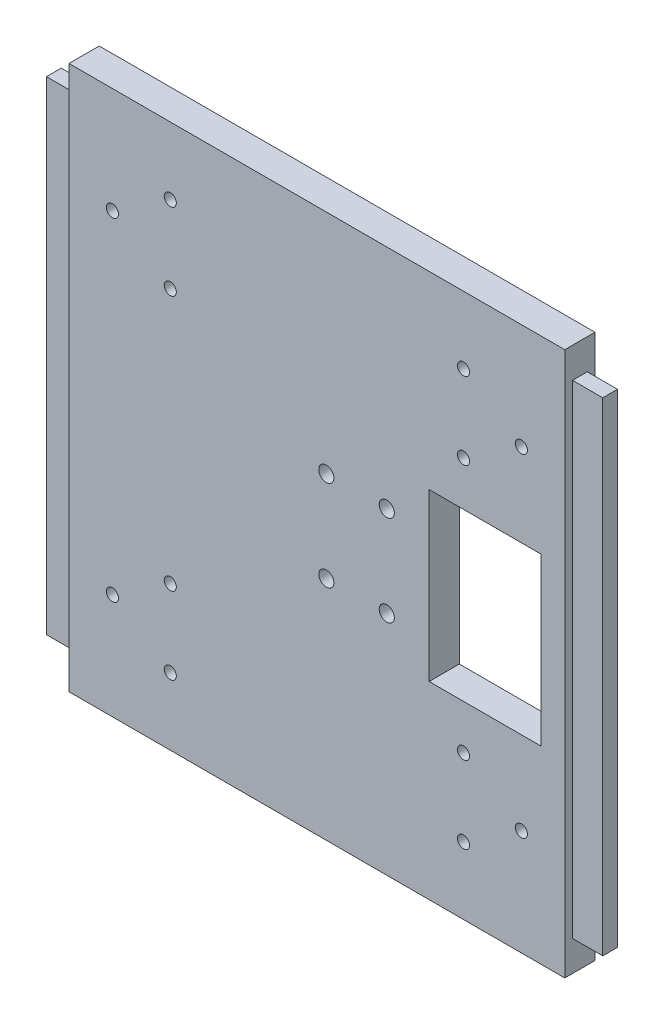
ISO-10303-21;
HEADER;
FILE_DESCRIPTION(('STEP AP214'),'2;1');
FILE_NAME('part.step','',(''),(''),'','','');
FILE_SCHEMA(('AUTOMOTIVE_DESIGN { 1 0 10303 214 1 1 1 1 }'));
ENDSEC;
DATA;
#1=APPLICATION_CONTEXT('core data for automotive mechanical design processes');
#2=APPLICATION_PROTOCOL_DEFINITION('international standard','automotive_design',2000,#1);
#3=PRODUCT_CONTEXT('',#1,'mechanical');
#4=PRODUCT('Part','Part','',(#3));
#5=PRODUCT_RELATED_PRODUCT_CATEGORY('part','',(#4));
#6=PRODUCT_DEFINITION_FORMATION('','',#4);
#7=PRODUCT_DEFINITION_CONTEXT('part definition',#1,'design');
#8=PRODUCT_DEFINITION('design','',#6,#7);
#9=PRODUCT_DEFINITION_SHAPE('','',#8);
#10=(LENGTH_UNIT() NAMED_UNIT(*) SI_UNIT(.MILLI.,.METRE.));
#11=(NAMED_UNIT(*) PLANE_ANGLE_UNIT() SI_UNIT($,.RADIAN.));
#12=(NAMED_UNIT(*) SI_UNIT($,.STERADIAN.) SOLID_ANGLE_UNIT());
#13=UNCERTAINTY_MEASURE_WITH_UNIT(LENGTH_MEASURE(1.E-05),#10,'distance_accuracy_value','');
#14=(GEOMETRIC_REPRESENTATION_CONTEXT(3) GLOBAL_UNCERTAINTY_ASSIGNED_CONTEXT((#13)) GLOBAL_UNIT_ASSIGNED_CONTEXT((#10,
#11,#12)) REPRESENTATION_CONTEXT('',''));
#15=CARTESIAN_POINT('',(0.,0.,0.));
#16=DIRECTION('',(0.,0.,1.));
#17=DIRECTION('',(1.,0.,0.));
#18=AXIS2_PLACEMENT_3D('',#15,#16,#17);
#19=CARTESIAN_POINT('',(0.,0.,10.));
#20=DIRECTION('',(1.,0.,0.));
#21=DIRECTION('',(0.,0.,-1.));
#22=AXIS2_PLACEMENT_3D('',#19,#20,#21);
#23=PLANE('',#22);
#24=DIRECTION('',(0.,-1.,0.));
#25=VECTOR('',#24,1.);
#26=CARTESIAN_POINT('',(0.,0.,0.));
#27=LINE('',#26,#25);
#28=CARTESIAN_POINT('',(0.,180.,0.));
#29=VERTEX_POINT('',#28);
#30=CARTESIAN_POINT('',(0.,0.,0.));
#31=VERTEX_POINT('',#30);
#32=EDGE_CURVE('E189',#29,#31,#27,.T.);
#33=ORIENTED_EDGE('',*,*,#32,.T.);
#34=DIRECTION('',(0.,0.,-1.));
#35=VECTOR('',#34,1.);
#36=CARTESIAN_POINT('',(0.,0.,10.));
#37=LINE('',#36,#35);
#38=CARTESIAN_POINT('',(0.,0.,10.));
#39=VERTEX_POINT('',#38);
#40=EDGE_CURVE('E162',#39,#31,#37,.T.);
#41=ORIENTED_EDGE('',*,*,#40,.F.);
#42=DIRECTION('',(0.,-1.,0.));
#43=VECTOR('',#42,1.);
#44=CARTESIAN_POINT('',(0.,0.,10.));
#45=LINE('',#44,#43);
#46=CARTESIAN_POINT('',(0.,180.,10.));
#47=VERTEX_POINT('',#46);
#48=EDGE_CURVE('E184',#47,#39,#45,.T.);
#49=ORIENTED_EDGE('',*,*,#48,.F.);
#50=DIRECTION('',(0.,0.,-1.));
#51=VECTOR('',#50,1.);
#52=CARTESIAN_POINT('',(0.,180.,10.));
#53=LINE('',#52,#51);
#54=EDGE_CURVE('E178',#47,#29,#53,.T.);
#55=ORIENTED_EDGE('',*,*,#54,.T.);
#56=EDGE_LOOP('',(#33,#41,#49,#55));
#57=FACE_BOUND('',#56,.T.);
#58=DIRECTION('',(0.,-1.,0.));
#59=VECTOR('',#58,1.);
#60=CARTESIAN_POINT('',(0.,169.94,2.55999999999999));
#61=LINE('',#60,#59);
#62=CARTESIAN_POINT('',(0.,169.94,2.55999999999999));
#63=VERTEX_POINT('',#62);
#64=CARTESIAN_POINT('',(0.,10.06,2.56000000000001));
#65=VERTEX_POINT('',#64);
#66=EDGE_CURVE('E222',#63,#65,#61,.T.);
#67=ORIENTED_EDGE('',*,*,#66,.F.);
#68=DIRECTION('',(0.,0.,-1.));
#69=VECTOR('',#68,1.);
#70=CARTESIAN_POINT('',(0.,169.94,2.55999999999999));
#71=LINE('',#70,#69);
#72=CARTESIAN_POINT('',(0.,169.94,7.43999999999999));
#73=VERTEX_POINT('',#72);
#74=EDGE_CURVE('E212',#73,#63,#71,.T.);
#75=ORIENTED_EDGE('',*,*,#74,.F.);
#76=DIRECTION('',(0.,1.,0.));
#77=VECTOR('',#76,1.);
#78=CARTESIAN_POINT('',(0.,169.94,7.43999999999999));
#79=LINE('',#78,#77);
#80=CARTESIAN_POINT('',(0.,10.06,7.44000000000001));
#81=VERTEX_POINT('',#80);
#82=EDGE_CURVE('E216',#81,#73,#79,.T.);
#83=ORIENTED_EDGE('',*,*,#82,.F.);
#84=DIRECTION('',(0.,0.,1.));
#85=VECTOR('',#84,1.);
#86=CARTESIAN_POINT('',(0.,10.06,2.56000000000001));
#87=LINE('',#86,#85);
#88=EDGE_CURVE('E219',#65,#81,#87,.T.);
#89=ORIENTED_EDGE('',*,*,#88,.F.);
#90=EDGE_LOOP('',(#67,#75,#83,#89));
#91=FACE_BOUND('',#90,.T.);
#92=ADVANCED_FACE('F37',(#57,#91),#23,.F.);
#93=CARTESIAN_POINT('',(0.,0.,10.));
#94=DIRECTION('',(0.,1.,0.));
#95=DIRECTION('',(0.,0.,1.));
#96=AXIS2_PLACEMENT_3D('',#93,#94,#95);
#97=PLANE('',#96);
#98=DIRECTION('',(1.,0.,0.));
#99=VECTOR('',#98,1.);
#100=CARTESIAN_POINT('',(0.,0.,0.));
#101=LINE('',#100,#99);
#102=CARTESIAN_POINT('',(164.,0.,0.));
#103=VERTEX_POINT('',#102);
#104=EDGE_CURVE('E187',#31,#103,#101,.T.);
#105=ORIENTED_EDGE('',*,*,#104,.T.);
#106=DIRECTION('',(0.,0.,-1.));
#107=VECTOR('',#106,1.);
#108=CARTESIAN_POINT('',(164.,0.,10.));
#109=LINE('',#108,#107);
#110=CARTESIAN_POINT('',(164.,0.,10.));
#111=VERTEX_POINT('',#110);
#112=EDGE_CURVE('E172',#111,#103,#109,.T.);
#113=ORIENTED_EDGE('',*,*,#112,.F.);
#114=DIRECTION('',(1.,0.,0.));
#115=VECTOR('',#114,1.);
#116=CARTESIAN_POINT('',(0.,0.,10.));
#117=LINE('',#116,#115);
#118=EDGE_CURVE('E196',#39,#111,#117,.T.);
#119=ORIENTED_EDGE('',*,*,#118,.F.);
#120=ORIENTED_EDGE('',*,*,#40,.T.);
#121=EDGE_LOOP('',(#105,#113,#119,#120));
#122=FACE_BOUND('',#121,.T.);
#123=ADVANCED_FACE('F425',(#122),#97,.F.);
#124=CARTESIAN_POINT('',(164.,0.,10.));
#125=DIRECTION('',(-1.,0.,0.));
#126=DIRECTION('',(0.,0.,1.));
#127=AXIS2_PLACEMENT_3D('',#124,#125,#126);
#128=PLANE('',#127);
#129=DIRECTION('',(0.,0.,-1.));
#130=VECTOR('',#129,1.);
#131=CARTESIAN_POINT('',(164.,169.94,2.55999999999999));
#132=LINE('',#131,#130);
#133=CARTESIAN_POINT('',(164.,169.94,7.43999999999999));
#134=VERTEX_POINT('',#133);
#135=CARTESIAN_POINT('',(164.,169.94,2.55999999999999));
#136=VERTEX_POINT('',#135);
#137=EDGE_CURVE('E249',#134,#136,#132,.T.);
#138=ORIENTED_EDGE('',*,*,#137,.T.);
#139=DIRECTION('',(0.,-1.,0.));
#140=VECTOR('',#139,1.);
#141=CARTESIAN_POINT('',(164.,169.94,2.55999999999999));
#142=LINE('',#141,#140);
#143=CARTESIAN_POINT('',(164.,10.06,2.56000000000001));
#144=VERTEX_POINT('',#143);
#145=EDGE_CURVE('E252',#136,#144,#142,.T.);
#146=ORIENTED_EDGE('',*,*,#145,.T.);
#147=DIRECTION('',(0.,0.,1.));
#148=VECTOR('',#147,1.);
#149=CARTESIAN_POINT('',(164.,10.06,2.56000000000001));
#150=LINE('',#149,#148);
#151=CARTESIAN_POINT('',(164.,10.06,7.44000000000001));
#152=VERTEX_POINT('',#151);
#153=EDGE_CURVE('E242',#144,#152,#150,.T.);
#154=ORIENTED_EDGE('',*,*,#153,.T.);
#155=DIRECTION('',(0.,1.,0.));
#156=VECTOR('',#155,1.);
#157=CARTESIAN_POINT('',(164.,169.94,7.43999999999999));
#158=LINE('',#157,#156);
#159=EDGE_CURVE('E246',#152,#134,#158,.T.);
#160=ORIENTED_EDGE('',*,*,#159,.T.);
#161=EDGE_LOOP('',(#138,#146,#154,#160));
#162=FACE_BOUND('',#161,.T.);
#163=DIRECTION('',(0.,1.,0.));
#164=VECTOR('',#163,1.);
#165=CARTESIAN_POINT('',(164.,0.,0.));
#166=LINE('',#165,#164);
#167=CARTESIAN_POINT('',(164.,180.,0.));
#168=VERTEX_POINT('',#167);
#169=EDGE_CURVE('E185',#103,#168,#166,.T.);
#170=ORIENTED_EDGE('',*,*,#169,.T.);
#171=DIRECTION('',(0.,0.,-1.));
#172=VECTOR('',#171,1.);
#173=CARTESIAN_POINT('',(164.,180.,10.));
#174=LINE('',#173,#172);
#175=CARTESIAN_POINT('',(164.,180.,10.));
#176=VERTEX_POINT('',#175);
#177=EDGE_CURVE('E175',#176,#168,#174,.T.);
#178=ORIENTED_EDGE('',*,*,#177,.F.);
#179=DIRECTION('',(0.,1.,0.));
#180=VECTOR('',#179,1.);
#181=CARTESIAN_POINT('',(164.,0.,10.));
#182=LINE('',#181,#180);
#183=EDGE_CURVE('E194',#111,#176,#182,.T.);
#184=ORIENTED_EDGE('',*,*,#183,.F.);
#185=ORIENTED_EDGE('',*,*,#112,.T.);
#186=EDGE_LOOP('',(#170,#178,#184,#185));
#187=FACE_BOUND('',#186,.T.);
#188=ADVANCED_FACE('F430',(#162,#187),#128,.F.);
#189=CARTESIAN_POINT('',(0.,180.,10.));
#190=DIRECTION('',(0.,-1.,0.));
#191=DIRECTION('',(0.,0.,-1.));
#192=AXIS2_PLACEMENT_3D('',#189,#190,#191);
#193=PLANE('',#192);
#194=DIRECTION('',(-1.,0.,0.));
#195=VECTOR('',#194,1.);
#196=CARTESIAN_POINT('',(0.,180.,0.));
#197=LINE('',#196,#195);
#198=EDGE_CURVE('E182',#168,#29,#197,.T.);
#199=ORIENTED_EDGE('',*,*,#198,.T.);
#200=ORIENTED_EDGE('',*,*,#54,.F.);
#201=DIRECTION('',(-1.,0.,0.));
#202=VECTOR('',#201,1.);
#203=CARTESIAN_POINT('',(0.,180.,10.));
#204=LINE('',#203,#202);
#205=EDGE_CURVE('E181',#176,#47,#204,.T.);
#206=ORIENTED_EDGE('',*,*,#205,.F.);
#207=ORIENTED_EDGE('',*,*,#177,.T.);
#208=EDGE_LOOP('',(#199,#200,#206,#207));
#209=FACE_BOUND('',#208,.T.);
#210=ADVANCED_FACE('F385',(#209),#193,.F.);
#211=CARTESIAN_POINT('',(0.,0.,10.));
#212=DIRECTION('',(0.,0.,-1.));
#213=DIRECTION('',(-1.,0.,0.));
#214=AXIS2_PLACEMENT_3D('',#211,#212,#213);
#215=PLANE('',#214);
#216=CARTESIAN_POINT('',(85.1178631754565,75.,10.));
#217=DIRECTION('',(0.,0.,1.));
#218=DIRECTION('',(1.,0.,0.));
#219=AXIS2_PLACEMENT_3D('',#216,#217,#218);
#220=CIRCLE('',#219,2.5);
#221=CARTESIAN_POINT('',(87.6178631754566,75.,10.));
#222=VERTEX_POINT('',#221);
#223=EDGE_CURVE('E153',#222,#222,#220,.T.);
#224=ORIENTED_EDGE('',*,*,#223,.F.);
#225=EDGE_LOOP('',(#224));
#226=FACE_BOUND('',#225,.T.);
#227=DIRECTION('',(1.,0.,0.));
#228=VECTOR('',#227,1.);
#229=CARTESIAN_POINT('',(119.117863175457,62.5,10.));
#230=LINE('',#229,#228);
#231=CARTESIAN_POINT('',(119.117863175457,62.5,10.));
#232=VERTEX_POINT('',#231);
#233=CARTESIAN_POINT('',(156.117863175457,62.5,10.));
#234=VERTEX_POINT('',#233);
#235=EDGE_CURVE('E352',#232,#234,#230,.T.);
#236=ORIENTED_EDGE('',*,*,#235,.F.);
#237=DIRECTION('',(0.,-1.,0.));
#238=VECTOR('',#237,1.);
#239=CARTESIAN_POINT('',(119.117863175457,117.5,10.));
#240=LINE('',#239,#238);
#241=CARTESIAN_POINT('',(119.117863175457,117.5,10.));
#242=VERTEX_POINT('',#241);
#243=EDGE_CURVE('E56',#242,#232,#240,.T.);
#244=ORIENTED_EDGE('',*,*,#243,.F.);
#245=DIRECTION('',(-1.,0.,0.));
#246=VECTOR('',#245,1.);
#247=CARTESIAN_POINT('',(119.117863175457,117.5,10.));
#248=LINE('',#247,#246);
#249=CARTESIAN_POINT('',(156.117863175457,117.5,10.));
#250=VERTEX_POINT('',#249);
#251=EDGE_CURVE('E152',#250,#242,#248,.T.);
#252=ORIENTED_EDGE('',*,*,#251,.F.);
#253=DIRECTION('',(0.,1.,0.));
#254=VECTOR('',#253,1.);
#255=CARTESIAN_POINT('',(156.117863175457,117.5,10.));
#256=LINE('',#255,#254);
#257=EDGE_CURVE('E349',#234,#250,#256,.T.);
#258=ORIENTED_EDGE('',*,*,#257,.F.);
#259=EDGE_LOOP('',(#236,#244,#252,#258));
#260=FACE_BOUND('',#259,.T.);
#261=CARTESIAN_POINT('',(105.117863175457,105.,10.));
#262=DIRECTION('',(0.,0.,1.));
#263=DIRECTION('',(1.,0.,0.));
#264=AXIS2_PLACEMENT_3D('',#261,#262,#263);
#265=CIRCLE('',#264,2.50000000000001);
#266=CARTESIAN_POINT('',(107.617863175457,105.,10.));
#267=VERTEX_POINT('',#266);
#268=EDGE_CURVE('E367',#267,#267,#265,.T.);
#269=ORIENTED_EDGE('',*,*,#268,.F.);
#270=EDGE_LOOP('',(#269));
#271=FACE_BOUND('',#270,.T.);
#272=CARTESIAN_POINT('',(105.117863175457,75.,10.));
#273=DIRECTION('',(0.,0.,1.));
#274=DIRECTION('',(1.,0.,0.));
#275=AXIS2_PLACEMENT_3D('',#272,#273,#274);
#276=CIRCLE('',#275,2.50000000000001);
#277=CARTESIAN_POINT('',(107.617863175457,75.,10.));
#278=VERTEX_POINT('',#277);
#279=EDGE_CURVE('E361',#278,#278,#276,.T.);
#280=ORIENTED_EDGE('',*,*,#279,.F.);
#281=EDGE_LOOP('',(#280));
#282=FACE_BOUND('',#281,.T.);
#283=CARTESIAN_POINT('',(85.1178631754565,105.,10.));
#284=DIRECTION('',(0.,0.,1.));
#285=DIRECTION('',(1.,0.,0.));
#286=AXIS2_PLACEMENT_3D('',#283,#284,#285);
#287=CIRCLE('',#286,2.5);
#288=CARTESIAN_POINT('',(87.6178631754566,105.,10.));
#289=VERTEX_POINT('',#288);
#290=EDGE_CURVE('E338',#289,#289,#287,.T.);
#291=ORIENTED_EDGE('',*,*,#290,.F.);
#292=EDGE_LOOP('',(#291));
#293=FACE_BOUND('',#292,.T.);
#294=CARTESIAN_POINT('',(149.642557300424,35.,10.));
#295=DIRECTION('',(0.,0.,-1.));
#296=DIRECTION('',(1.,0.,0.));
#297=AXIS2_PLACEMENT_3D('',#294,#295,#296);
#298=CIRCLE('',#297,2.);
#299=CARTESIAN_POINT('',(151.642557300424,35.,10.));
#300=VERTEX_POINT('',#299);
#301=EDGE_CURVE('E299',#300,#300,#298,.T.);
#302=ORIENTED_EDGE('',*,*,#301,.T.);
#303=EDGE_LOOP('',(#302));
#304=FACE_BOUND('',#303,.T.);
#305=CARTESIAN_POINT('',(130.5,22.25,10.));
#306=DIRECTION('',(0.,0.,-1.));
#307=DIRECTION('',(1.,0.,0.));
#308=AXIS2_PLACEMENT_3D('',#305,#306,#307);
#309=CIRCLE('',#308,2.);
#310=CARTESIAN_POINT('',(132.5,22.25,10.));
#311=VERTEX_POINT('',#310);
#312=EDGE_CURVE('E306',#311,#311,#309,.T.);
#313=ORIENTED_EDGE('',*,*,#312,.T.);
#314=EDGE_LOOP('',(#313));
#315=FACE_BOUND('',#314,.T.);
#316=CARTESIAN_POINT('',(130.5,47.75,10.));
#317=DIRECTION('',(0.,0.,-1.));
#318=DIRECTION('',(1.,0.,0.));
#319=AXIS2_PLACEMENT_3D('',#316,#317,#318);
#320=CIRCLE('',#319,2.);
#321=CARTESIAN_POINT('',(132.5,47.75,10.));
#322=VERTEX_POINT('',#321);
#323=EDGE_CURVE('E312',#322,#322,#320,.T.);
#324=ORIENTED_EDGE('',*,*,#323,.T.);
#325=EDGE_LOOP('',(#324));
#326=FACE_BOUND('',#325,.T.);
#327=CARTESIAN_POINT('',(33.5,132.25,10.));
#328=DIRECTION('',(0.,0.,-1.));
#329=DIRECTION('',(-1.,0.,0.));
#330=AXIS2_PLACEMENT_3D('',#327,#328,#329);
#331=CIRCLE('',#330,2.);
#332=CARTESIAN_POINT('',(31.5,132.25,10.));
#333=VERTEX_POINT('',#332);
#334=EDGE_CURVE('E276',#333,#333,#331,.T.);
#335=ORIENTED_EDGE('',*,*,#334,.T.);
#336=EDGE_LOOP('',(#335));
#337=FACE_BOUND('',#336,.T.);
#338=CARTESIAN_POINT('',(33.5,157.75,10.));
#339=DIRECTION('',(0.,0.,-1.));
#340=DIRECTION('',(-1.,0.,0.));
#341=AXIS2_PLACEMENT_3D('',#338,#339,#340);
#342=CIRCLE('',#341,2.00000000000001);
#343=CARTESIAN_POINT('',(31.5,157.75,10.));
#344=VERTEX_POINT('',#343);
#345=EDGE_CURVE('E275',#344,#344,#342,.T.);
#346=ORIENTED_EDGE('',*,*,#345,.T.);
#347=EDGE_LOOP('',(#346));
#348=FACE_BOUND('',#347,.T.);
#349=CARTESIAN_POINT('',(14.3574426995764,145.,10.));
#350=DIRECTION('',(0.,0.,-1.));
#351=DIRECTION('',(-1.,0.,0.));
#352=AXIS2_PLACEMENT_3D('',#349,#350,#351);
#353=CIRCLE('',#352,2.);
#354=CARTESIAN_POINT('',(12.3574426995764,145.,10.));
#355=VERTEX_POINT('',#354);
#356=EDGE_CURVE('E282',#355,#355,#353,.T.);
#357=ORIENTED_EDGE('',*,*,#356,.T.);
#358=EDGE_LOOP('',(#357));
#359=FACE_BOUND('',#358,.T.);
#360=CARTESIAN_POINT('',(130.5,132.25,10.));
#361=DIRECTION('',(0.,0.,-1.));
#362=DIRECTION('',(-1.,0.,0.));
#363=AXIS2_PLACEMENT_3D('',#360,#361,#362);
#364=CIRCLE('',#363,2.);
#365=CARTESIAN_POINT('',(128.5,132.25,10.));
#366=VERTEX_POINT('',#365);
#367=EDGE_CURVE('E288',#366,#366,#364,.T.);
#368=ORIENTED_EDGE('',*,*,#367,.T.);
#369=EDGE_LOOP('',(#368));
#370=FACE_BOUND('',#369,.T.);
#371=CARTESIAN_POINT('',(130.5,157.75,10.));
#372=DIRECTION('',(0.,0.,-1.));
#373=DIRECTION('',(-1.,0.,0.));
#374=AXIS2_PLACEMENT_3D('',#371,#372,#373);
#375=CIRCLE('',#374,2.);
#376=CARTESIAN_POINT('',(128.5,157.75,10.));
#377=VERTEX_POINT('',#376);
#378=EDGE_CURVE('E269',#377,#377,#375,.T.);
#379=ORIENTED_EDGE('',*,*,#378,.T.);
#380=EDGE_LOOP('',(#379));
#381=FACE_BOUND('',#380,.T.);
#382=CARTESIAN_POINT('',(33.5,47.75,10.));
#383=DIRECTION('',(0.,0.,-1.));
#384=DIRECTION('',(1.,0.,0.));
#385=AXIS2_PLACEMENT_3D('',#382,#383,#384);
#386=CIRCLE('',#385,2.);
#387=CARTESIAN_POINT('',(35.5,47.75,10.));
#388=VERTEX_POINT('',#387);
#389=EDGE_CURVE('E300',#388,#388,#386,.T.);
#390=ORIENTED_EDGE('',*,*,#389,.T.);
#391=EDGE_LOOP('',(#390));
#392=FACE_BOUND('',#391,.T.);
#393=CARTESIAN_POINT('',(33.5,22.25,10.));
#394=DIRECTION('',(0.,0.,-1.));
#395=DIRECTION('',(1.,0.,0.));
#396=AXIS2_PLACEMENT_3D('',#393,#394,#395);
#397=CIRCLE('',#396,2.00000000000001);
#398=CARTESIAN_POINT('',(35.5,22.25,10.));
#399=VERTEX_POINT('',#398);
#400=EDGE_CURVE('E330',#399,#399,#397,.T.);
#401=ORIENTED_EDGE('',*,*,#400,.T.);
#402=EDGE_LOOP('',(#401));
#403=FACE_BOUND('',#402,.T.);
#404=CARTESIAN_POINT('',(14.3574426995764,35.,10.));
#405=DIRECTION('',(0.,0.,-1.));
#406=DIRECTION('',(1.,0.,0.));
#407=AXIS2_PLACEMENT_3D('',#404,#405,#406);
#408=CIRCLE('',#407,2.);
#409=CARTESIAN_POINT('',(16.3574426995764,35.,10.));
#410=VERTEX_POINT('',#409);
#411=EDGE_CURVE('E323',#410,#410,#408,.T.);
#412=ORIENTED_EDGE('',*,*,#411,.T.);
#413=EDGE_LOOP('',(#412));
#414=FACE_BOUND('',#413,.T.);
#415=CARTESIAN_POINT('',(149.642557300424,145.,10.));
#416=DIRECTION('',(0.,0.,-1.));
#417=DIRECTION('',(-1.,0.,0.));
#418=AXIS2_PLACEMENT_3D('',#415,#416,#417);
#419=CIRCLE('',#418,2.);
#420=CARTESIAN_POINT('',(147.642557300424,145.,10.));
#421=VERTEX_POINT('',#420);
#422=EDGE_CURVE('E255',#421,#421,#419,.T.);
#423=ORIENTED_EDGE('',*,*,#422,.T.);
#424=EDGE_LOOP('',(#423));
#425=FACE_BOUND('',#424,.T.);
#426=ORIENTED_EDGE('',*,*,#48,.T.);
#427=ORIENTED_EDGE('',*,*,#118,.T.);
#428=ORIENTED_EDGE('',*,*,#183,.T.);
#429=ORIENTED_EDGE('',*,*,#205,.T.);
#430=EDGE_LOOP('',(#426,#427,#428,#429));
#431=FACE_BOUND('',#430,.T.);
#432=ADVANCED_FACE('F382',(#226,#260,#271,#282,#293,#304,#315,#326,#337,#348,#359,#370,#381,
#392,#403,#414,#425,#431),#215,.F.);
#433=CARTESIAN_POINT('',(0.,0.,0.));
#434=DIRECTION('',(0.,0.,-1.));
#435=DIRECTION('',(-1.,0.,0.));
#436=AXIS2_PLACEMENT_3D('',#433,#434,#435);
#437=PLANE('',#436);
#438=DIRECTION('',(1.,0.,0.));
#439=VECTOR('',#438,1.);
#440=CARTESIAN_POINT('',(0.,117.5,0.));
#441=LINE('',#440,#439);
#442=CARTESIAN_POINT('',(119.117863175457,117.5,0.));
#443=VERTEX_POINT('',#442);
#444=CARTESIAN_POINT('',(156.117863175457,117.5,0.));
#445=VERTEX_POINT('',#444);
#446=EDGE_CURVE('E11',#443,#445,#441,.T.);
#447=ORIENTED_EDGE('',*,*,#446,.F.);
#448=DIRECTION('',(0.,1.,0.));
#449=VECTOR('',#448,1.);
#450=CARTESIAN_POINT('',(119.117863175457,0.,0.));
#451=LINE('',#450,#449);
#452=CARTESIAN_POINT('',(119.117863175457,62.5,0.));
#453=VERTEX_POINT('',#452);
#454=EDGE_CURVE('E157',#453,#443,#451,.T.);
#455=ORIENTED_EDGE('',*,*,#454,.F.);
#456=DIRECTION('',(-1.,0.,0.));
#457=VECTOR('',#456,1.);
#458=CARTESIAN_POINT('',(0.,62.5,0.));
#459=LINE('',#458,#457);
#460=CARTESIAN_POINT('',(156.117863175457,62.5,0.));
#461=VERTEX_POINT('',#460);
#462=EDGE_CURVE('E161',#461,#453,#459,.T.);
#463=ORIENTED_EDGE('',*,*,#462,.F.);
#464=DIRECTION('',(0.,-1.,0.));
#465=VECTOR('',#464,1.);
#466=CARTESIAN_POINT('',(156.117863175457,0.,0.));
#467=LINE('',#466,#465);
#468=EDGE_CURVE('E44',#445,#461,#467,.T.);
#469=ORIENTED_EDGE('',*,*,#468,.F.);
#470=EDGE_LOOP('',(#447,#455,#463,#469));
#471=FACE_BOUND('',#470,.T.);
#472=CARTESIAN_POINT('',(149.642557300424,35.,0.));
#473=DIRECTION('',(0.,0.,-1.));
#474=DIRECTION('',(1.,0.,0.));
#475=AXIS2_PLACEMENT_3D('',#472,#473,#474);
#476=CIRCLE('',#475,2.);
#477=CARTESIAN_POINT('',(151.642557300424,35.,0.));
#478=VERTEX_POINT('',#477);
#479=EDGE_CURVE('E296',#478,#478,#476,.T.);
#480=ORIENTED_EDGE('',*,*,#479,.F.);
#481=EDGE_LOOP('',(#480));
#482=FACE_BOUND('',#481,.T.);
#483=CARTESIAN_POINT('',(130.5,22.25,0.));
#484=DIRECTION('',(0.,0.,-1.));
#485=DIRECTION('',(1.,0.,0.));
#486=AXIS2_PLACEMENT_3D('',#483,#484,#485);
#487=CIRCLE('',#486,2.);
#488=CARTESIAN_POINT('',(132.5,22.25,0.));
#489=VERTEX_POINT('',#488);
#490=EDGE_CURVE('E303',#489,#489,#487,.T.);
#491=ORIENTED_EDGE('',*,*,#490,.F.);
#492=EDGE_LOOP('',(#491));
#493=FACE_BOUND('',#492,.T.);
#494=CARTESIAN_POINT('',(130.5,47.75,0.));
#495=DIRECTION('',(0.,0.,-1.));
#496=DIRECTION('',(1.,0.,0.));
#497=AXIS2_PLACEMENT_3D('',#494,#495,#496);
#498=CIRCLE('',#497,2.);
#499=CARTESIAN_POINT('',(132.5,47.75,0.));
#500=VERTEX_POINT('',#499);
#501=EDGE_CURVE('E309',#500,#500,#498,.T.);
#502=ORIENTED_EDGE('',*,*,#501,.F.);
#503=EDGE_LOOP('',(#502));
#504=FACE_BOUND('',#503,.T.);
#505=CARTESIAN_POINT('',(33.5,132.25,0.));
#506=DIRECTION('',(0.,0.,-1.));
#507=DIRECTION('',(-1.,0.,0.));
#508=AXIS2_PLACEMENT_3D('',#505,#506,#507);
#509=CIRCLE('',#508,2.);
#510=CARTESIAN_POINT('',(31.5,132.25,0.));
#511=VERTEX_POINT('',#510);
#512=EDGE_CURVE('E315',#511,#511,#509,.T.);
#513=ORIENTED_EDGE('',*,*,#512,.F.);
#514=EDGE_LOOP('',(#513));
#515=FACE_BOUND('',#514,.T.);
#516=CARTESIAN_POINT('',(33.5,157.75,0.));
#517=DIRECTION('',(0.,0.,-1.));
#518=DIRECTION('',(-1.,0.,0.));
#519=AXIS2_PLACEMENT_3D('',#516,#517,#518);
#520=CIRCLE('',#519,2.00000000000001);
#521=CARTESIAN_POINT('',(31.5,157.75,0.));
#522=VERTEX_POINT('',#521);
#523=EDGE_CURVE('E272',#522,#522,#520,.T.);
#524=ORIENTED_EDGE('',*,*,#523,.F.);
#525=EDGE_LOOP('',(#524));
#526=FACE_BOUND('',#525,.T.);
#527=CARTESIAN_POINT('',(14.3574426995764,145.,0.));
#528=DIRECTION('',(0.,0.,-1.));
#529=DIRECTION('',(-1.,0.,0.));
#530=AXIS2_PLACEMENT_3D('',#527,#528,#529);
#531=CIRCLE('',#530,2.);
#532=CARTESIAN_POINT('',(12.3574426995764,145.,0.));
#533=VERTEX_POINT('',#532);
#534=EDGE_CURVE('E279',#533,#533,#531,.T.);
#535=ORIENTED_EDGE('',*,*,#534,.F.);
#536=EDGE_LOOP('',(#535));
#537=FACE_BOUND('',#536,.T.);
#538=CARTESIAN_POINT('',(130.5,132.25,0.));
#539=DIRECTION('',(0.,0.,-1.));
#540=DIRECTION('',(-1.,0.,0.));
#541=AXIS2_PLACEMENT_3D('',#538,#539,#540);
#542=CIRCLE('',#541,2.);
#543=CARTESIAN_POINT('',(128.5,132.25,0.));
#544=VERTEX_POINT('',#543);
#545=EDGE_CURVE('E285',#544,#544,#542,.T.);
#546=ORIENTED_EDGE('',*,*,#545,.F.);
#547=EDGE_LOOP('',(#546));
#548=FACE_BOUND('',#547,.T.);
#549=CARTESIAN_POINT('',(130.5,157.75,0.));
#550=DIRECTION('',(0.,0.,-1.));
#551=DIRECTION('',(-1.,0.,0.));
#552=AXIS2_PLACEMENT_3D('',#549,#550,#551);
#553=CIRCLE('',#552,2.);
#554=CARTESIAN_POINT('',(128.5,157.75,0.));
#555=VERTEX_POINT('',#554);
#556=EDGE_CURVE('E291',#555,#555,#553,.T.);
#557=ORIENTED_EDGE('',*,*,#556,.F.);
#558=EDGE_LOOP('',(#557));
#559=FACE_BOUND('',#558,.T.);
#560=CARTESIAN_POINT('',(33.5,47.75,0.));
#561=DIRECTION('',(0.,0.,-1.));
#562=DIRECTION('',(1.,0.,0.));
#563=AXIS2_PLACEMENT_3D('',#560,#561,#562);
#564=CIRCLE('',#563,2.);
#565=CARTESIAN_POINT('',(35.5,47.75,0.));
#566=VERTEX_POINT('',#565);
#567=EDGE_CURVE('E333',#566,#566,#564,.T.);
#568=ORIENTED_EDGE('',*,*,#567,.F.);
#569=EDGE_LOOP('',(#568));
#570=FACE_BOUND('',#569,.T.);
#571=CARTESIAN_POINT('',(33.5,22.25,0.));
#572=DIRECTION('',(0.,0.,-1.));
#573=DIRECTION('',(1.,0.,0.));
#574=AXIS2_PLACEMENT_3D('',#571,#572,#573);
#575=CIRCLE('',#574,2.00000000000001);
#576=CARTESIAN_POINT('',(35.5,22.25,0.));
#577=VERTEX_POINT('',#576);
#578=EDGE_CURVE('E327',#577,#577,#575,.T.);
#579=ORIENTED_EDGE('',*,*,#578,.F.);
#580=EDGE_LOOP('',(#579));
#581=FACE_BOUND('',#580,.T.);
#582=CARTESIAN_POINT('',(14.3574426995764,35.,0.));
#583=DIRECTION('',(0.,0.,-1.));
#584=DIRECTION('',(1.,0.,0.));
#585=AXIS2_PLACEMENT_3D('',#582,#583,#584);
#586=CIRCLE('',#585,2.);
#587=CARTESIAN_POINT('',(16.3574426995764,35.,0.));
#588=VERTEX_POINT('',#587);
#589=EDGE_CURVE('E320',#588,#588,#586,.T.);
#590=ORIENTED_EDGE('',*,*,#589,.F.);
#591=EDGE_LOOP('',(#590));
#592=FACE_BOUND('',#591,.T.);
#593=CARTESIAN_POINT('',(149.642557300424,145.,0.));
#594=DIRECTION('',(0.,0.,-1.));
#595=DIRECTION('',(-1.,0.,0.));
#596=AXIS2_PLACEMENT_3D('',#593,#594,#595);
#597=CIRCLE('',#596,2.);
#598=CARTESIAN_POINT('',(147.642557300424,145.,0.));
#599=VERTEX_POINT('',#598);
#600=EDGE_CURVE('E266',#599,#599,#597,.T.);
#601=ORIENTED_EDGE('',*,*,#600,.F.);
#602=EDGE_LOOP('',(#601));
#603=FACE_BOUND('',#602,.T.);
#604=ORIENTED_EDGE('',*,*,#32,.F.);
#605=ORIENTED_EDGE('',*,*,#198,.F.);
#606=ORIENTED_EDGE('',*,*,#169,.F.);
#607=ORIENTED_EDGE('',*,*,#104,.F.);
#608=EDGE_LOOP('',(#604,#605,#606,#607));
#609=FACE_BOUND('',#608,.T.);
#610=ADVANCED_FACE('F164',(#471,#482,#493,#504,#515,#526,#537,#548,#559,#570,#581,#592,#603,
#609),#437,.T.);
#611=CARTESIAN_POINT('',(-10.,169.94,2.55999999999999));
#612=DIRECTION('',(0.,0.,1.));
#613=DIRECTION('',(0.,-1.,0.));
#614=AXIS2_PLACEMENT_3D('',#611,#612,#613);
#615=PLANE('',#614);
#616=ORIENTED_EDGE('',*,*,#66,.T.);
#617=DIRECTION('',(1.,0.,0.));
#618=VECTOR('',#617,1.);
#619=CARTESIAN_POINT('',(-10.,10.06,2.56000000000001));
#620=LINE('',#619,#618);
#621=CARTESIAN_POINT('',(-10.,10.06,2.56000000000001));
#622=VERTEX_POINT('',#621);
#623=EDGE_CURVE('E192',#622,#65,#620,.T.);
#624=ORIENTED_EDGE('',*,*,#623,.F.);
#625=DIRECTION('',(0.,-1.,0.));
#626=VECTOR('',#625,1.);
#627=CARTESIAN_POINT('',(-10.,169.94,2.55999999999999));
#628=LINE('',#627,#626);
#629=CARTESIAN_POINT('',(-10.,169.94,2.55999999999999));
#630=VERTEX_POINT('',#629);
#631=EDGE_CURVE('E215',#630,#622,#628,.T.);
#632=ORIENTED_EDGE('',*,*,#631,.F.);
#633=DIRECTION('',(1.,0.,0.));
#634=VECTOR('',#633,1.);
#635=CARTESIAN_POINT('',(-10.,169.94,2.55999999999999));
#636=LINE('',#635,#634);
#637=EDGE_CURVE('E208',#630,#63,#636,.T.);
#638=ORIENTED_EDGE('',*,*,#637,.T.);
#639=EDGE_LOOP('',(#616,#624,#632,#638));
#640=FACE_BOUND('',#639,.T.);
#641=ADVANCED_FACE('F435',(#640),#615,.F.);
#642=CARTESIAN_POINT('',(-10.,10.06,2.56000000000001));
#643=DIRECTION('',(0.,1.,0.));
#644=DIRECTION('',(0.,0.,1.));
#645=AXIS2_PLACEMENT_3D('',#642,#643,#644);
#646=PLANE('',#645);
#647=ORIENTED_EDGE('',*,*,#88,.T.);
#648=DIRECTION('',(1.,0.,0.));
#649=VECTOR('',#648,1.);
#650=CARTESIAN_POINT('',(-10.,10.06,7.44000000000001));
#651=LINE('',#650,#649);
#652=CARTESIAN_POINT('',(-10.,10.06,7.44000000000001));
#653=VERTEX_POINT('',#652);
#654=EDGE_CURVE('E202',#653,#81,#651,.T.);
#655=ORIENTED_EDGE('',*,*,#654,.F.);
#656=DIRECTION('',(0.,0.,1.));
#657=VECTOR('',#656,1.);
#658=CARTESIAN_POINT('',(-10.,10.06,2.56000000000001));
#659=LINE('',#658,#657);
#660=EDGE_CURVE('E229',#622,#653,#659,.T.);
#661=ORIENTED_EDGE('',*,*,#660,.F.);
#662=ORIENTED_EDGE('',*,*,#623,.T.);
#663=EDGE_LOOP('',(#647,#655,#661,#662));
#664=FACE_BOUND('',#663,.T.);
#665=ADVANCED_FACE('F440',(#664),#646,.F.);
#666=CARTESIAN_POINT('',(-10.,169.94,7.43999999999999));
#667=DIRECTION('',(0.,0.,-1.));
#668=DIRECTION('',(0.,1.,0.));
#669=AXIS2_PLACEMENT_3D('',#666,#667,#668);
#670=PLANE('',#669);
#671=ORIENTED_EDGE('',*,*,#82,.T.);
#672=DIRECTION('',(1.,0.,0.));
#673=VECTOR('',#672,1.);
#674=CARTESIAN_POINT('',(-10.,169.94,7.43999999999999));
#675=LINE('',#674,#673);
#676=CARTESIAN_POINT('',(-10.,169.94,7.43999999999999));
#677=VERTEX_POINT('',#676);
#678=EDGE_CURVE('E205',#677,#73,#675,.T.);
#679=ORIENTED_EDGE('',*,*,#678,.F.);
#680=DIRECTION('',(0.,1.,0.));
#681=VECTOR('',#680,1.);
#682=CARTESIAN_POINT('',(-10.,169.94,7.43999999999999));
#683=LINE('',#682,#681);
#684=EDGE_CURVE('E227',#653,#677,#683,.T.);
#685=ORIENTED_EDGE('',*,*,#684,.F.);
#686=ORIENTED_EDGE('',*,*,#654,.T.);
#687=EDGE_LOOP('',(#671,#679,#685,#686));
#688=FACE_BOUND('',#687,.T.);
#689=ADVANCED_FACE('F671',(#688),#670,.F.);
#690=CARTESIAN_POINT('',(-10.,169.94,2.55999999999999));
#691=DIRECTION('',(0.,-1.,0.));
#692=DIRECTION('',(0.,0.,-1.));
#693=AXIS2_PLACEMENT_3D('',#690,#691,#692);
#694=PLANE('',#693);
#695=ORIENTED_EDGE('',*,*,#74,.T.);
#696=ORIENTED_EDGE('',*,*,#637,.F.);
#697=DIRECTION('',(0.,0.,-1.));
#698=VECTOR('',#697,1.);
#699=CARTESIAN_POINT('',(-10.,169.94,2.55999999999999));
#700=LINE('',#699,#698);
#701=EDGE_CURVE('E211',#677,#630,#700,.T.);
#702=ORIENTED_EDGE('',*,*,#701,.F.);
#703=ORIENTED_EDGE('',*,*,#678,.T.);
#704=EDGE_LOOP('',(#695,#696,#702,#703));
#705=FACE_BOUND('',#704,.T.);
#706=ADVANCED_FACE('F667',(#705),#694,.F.);
#707=CARTESIAN_POINT('',(-10.,0.,0.));
#708=DIRECTION('',(-1.,0.,0.));
#709=DIRECTION('',(0.,0.,1.));
#710=AXIS2_PLACEMENT_3D('',#707,#708,#709);
#711=PLANE('',#710);
#712=ORIENTED_EDGE('',*,*,#631,.T.);
#713=ORIENTED_EDGE('',*,*,#660,.T.);
#714=ORIENTED_EDGE('',*,*,#684,.T.);
#715=ORIENTED_EDGE('',*,*,#701,.T.);
#716=EDGE_LOOP('',(#712,#713,#714,#715));
#717=FACE_BOUND('',#716,.T.);
#718=ADVANCED_FACE('F663',(#717),#711,.T.);
#719=CARTESIAN_POINT('',(174.,169.94,2.55999999999999));
#720=DIRECTION('',(0.,0.,-1.));
#721=DIRECTION('',(0.,1.,0.));
#722=AXIS2_PLACEMENT_3D('',#719,#720,#721);
#723=PLANE('',#722);
#724=ORIENTED_EDGE('',*,*,#145,.F.);
#725=DIRECTION('',(-1.,0.,0.));
#726=VECTOR('',#725,1.);
#727=CARTESIAN_POINT('',(174.,169.94,2.55999999999999));
#728=LINE('',#727,#726);
#729=CARTESIAN_POINT('',(174.,169.94,2.55999999999999));
#730=VERTEX_POINT('',#729);
#731=EDGE_CURVE('E225',#730,#136,#728,.T.);
#732=ORIENTED_EDGE('',*,*,#731,.F.);
#733=DIRECTION('',(0.,-1.,0.));
#734=VECTOR('',#733,1.);
#735=CARTESIAN_POINT('',(174.,169.94,2.55999999999999));
#736=LINE('',#735,#734);
#737=CARTESIAN_POINT('',(174.,10.06,2.56000000000001));
#738=VERTEX_POINT('',#737);
#739=EDGE_CURVE('E245',#730,#738,#736,.T.);
#740=ORIENTED_EDGE('',*,*,#739,.T.);
#741=DIRECTION('',(-1.,0.,0.));
#742=VECTOR('',#741,1.);
#743=CARTESIAN_POINT('',(174.,10.06,2.56000000000001));
#744=LINE('',#743,#742);
#745=EDGE_CURVE('E239',#738,#144,#744,.T.);
#746=ORIENTED_EDGE('',*,*,#745,.T.);
#747=EDGE_LOOP('',(#724,#732,#740,#746));
#748=FACE_BOUND('',#747,.T.);
#749=ADVANCED_FACE('F659',(#748),#723,.T.);
#750=CARTESIAN_POINT('',(174.,169.94,2.55999999999999));
#751=DIRECTION('',(0.,1.,0.));
#752=DIRECTION('',(0.,0.,1.));
#753=AXIS2_PLACEMENT_3D('',#750,#751,#752);
#754=PLANE('',#753);
#755=ORIENTED_EDGE('',*,*,#137,.F.);
#756=DIRECTION('',(-1.,0.,0.));
#757=VECTOR('',#756,1.);
#758=CARTESIAN_POINT('',(174.,169.94,7.43999999999999));
#759=LINE('',#758,#757);
#760=CARTESIAN_POINT('',(174.,169.94,7.43999999999999));
#761=VERTEX_POINT('',#760);
#762=EDGE_CURVE('E235',#761,#134,#759,.T.);
#763=ORIENTED_EDGE('',*,*,#762,.F.);
#764=DIRECTION('',(0.,0.,-1.));
#765=VECTOR('',#764,1.);
#766=CARTESIAN_POINT('',(174.,169.94,2.55999999999999));
#767=LINE('',#766,#765);
#768=EDGE_CURVE('E261',#761,#730,#767,.T.);
#769=ORIENTED_EDGE('',*,*,#768,.T.);
#770=ORIENTED_EDGE('',*,*,#731,.T.);
#771=EDGE_LOOP('',(#755,#763,#769,#770));
#772=FACE_BOUND('',#771,.T.);
#773=ADVANCED_FACE('F655',(#772),#754,.T.);
#774=CARTESIAN_POINT('',(174.,169.94,7.43999999999999));
#775=DIRECTION('',(0.,0.,1.));
#776=DIRECTION('',(0.,-1.,0.));
#777=AXIS2_PLACEMENT_3D('',#774,#775,#776);
#778=PLANE('',#777);
#779=ORIENTED_EDGE('',*,*,#159,.F.);
#780=DIRECTION('',(-1.,0.,0.));
#781=VECTOR('',#780,1.);
#782=CARTESIAN_POINT('',(174.,10.06,7.44000000000001));
#783=LINE('',#782,#781);
#784=CARTESIAN_POINT('',(174.,10.06,7.44000000000001));
#785=VERTEX_POINT('',#784);
#786=EDGE_CURVE('E237',#785,#152,#783,.T.);
#787=ORIENTED_EDGE('',*,*,#786,.F.);
#788=DIRECTION('',(0.,1.,0.));
#789=VECTOR('',#788,1.);
#790=CARTESIAN_POINT('',(174.,169.94,7.43999999999999));
#791=LINE('',#790,#789);
#792=EDGE_CURVE('E258',#785,#761,#791,.T.);
#793=ORIENTED_EDGE('',*,*,#792,.T.);
#794=ORIENTED_EDGE('',*,*,#762,.T.);
#795=EDGE_LOOP('',(#779,#787,#793,#794));
#796=FACE_BOUND('',#795,.T.);
#797=ADVANCED_FACE('F651',(#796),#778,.T.);
#798=CARTESIAN_POINT('',(174.,10.06,2.56000000000001));
#799=DIRECTION('',(0.,-1.,0.));
#800=DIRECTION('',(0.,0.,-1.));
#801=AXIS2_PLACEMENT_3D('',#798,#799,#800);
#802=PLANE('',#801);
#803=ORIENTED_EDGE('',*,*,#153,.F.);
#804=ORIENTED_EDGE('',*,*,#745,.F.);
#805=DIRECTION('',(0.,0.,1.));
#806=VECTOR('',#805,1.);
#807=CARTESIAN_POINT('',(174.,10.06,2.56000000000001));
#808=LINE('',#807,#806);
#809=EDGE_CURVE('E241',#738,#785,#808,.T.);
#810=ORIENTED_EDGE('',*,*,#809,.T.);
#811=ORIENTED_EDGE('',*,*,#786,.T.);
#812=EDGE_LOOP('',(#803,#804,#810,#811));
#813=FACE_BOUND('',#812,.T.);
#814=ADVANCED_FACE('F647',(#813),#802,.T.);
#815=CARTESIAN_POINT('',(174.,0.,0.));
#816=DIRECTION('',(1.,0.,0.));
#817=DIRECTION('',(0.,0.,1.));
#818=AXIS2_PLACEMENT_3D('',#815,#816,#817);
#819=PLANE('',#818);
#820=ORIENTED_EDGE('',*,*,#739,.F.);
#821=ORIENTED_EDGE('',*,*,#768,.F.);
#822=ORIENTED_EDGE('',*,*,#792,.F.);
#823=ORIENTED_EDGE('',*,*,#809,.F.);
#824=EDGE_LOOP('',(#820,#821,#822,#823));
#825=FACE_BOUND('',#824,.T.);
#826=ADVANCED_FACE('F643',(#825),#819,.T.);
#827=CARTESIAN_POINT('',(149.642557300424,145.,10.));
#828=DIRECTION('',(0.,0.,-1.));
#829=DIRECTION('',(-1.,0.,0.));
#830=AXIS2_PLACEMENT_3D('',#827,#828,#829);
#831=CYLINDRICAL_SURFACE('',#830,2.);
#832=ORIENTED_EDGE('',*,*,#422,.F.);
#833=EDGE_LOOP('',(#832));
#834=FACE_BOUND('',#833,.T.);
#835=ORIENTED_EDGE('',*,*,#600,.T.);
#836=EDGE_LOOP('',(#835));
#837=FACE_BOUND('',#836,.T.);
#838=ADVANCED_FACE('F610',(#834,#837),#831,.F.);
#839=CARTESIAN_POINT('',(14.3574426995764,35.,10.));
#840=DIRECTION('',(0.,0.,-1.));
#841=DIRECTION('',(-1.,0.,0.));
#842=AXIS2_PLACEMENT_3D('',#839,#840,#841);
#843=CYLINDRICAL_SURFACE('',#842,2.);
#844=ORIENTED_EDGE('',*,*,#411,.F.);
#845=EDGE_LOOP('',(#844));
#846=FACE_BOUND('',#845,.T.);
#847=ORIENTED_EDGE('',*,*,#589,.T.);
#848=EDGE_LOOP('',(#847));
#849=FACE_BOUND('',#848,.T.);
#850=ADVANCED_FACE('F606',(#846,#849),#843,.F.);
#851=CARTESIAN_POINT('',(33.5,22.25,10.));
#852=DIRECTION('',(0.,0.,-1.));
#853=DIRECTION('',(-1.,0.,0.));
#854=AXIS2_PLACEMENT_3D('',#851,#852,#853);
#855=CYLINDRICAL_SURFACE('',#854,2.00000000000001);
#856=ORIENTED_EDGE('',*,*,#400,.F.);
#857=EDGE_LOOP('',(#856));
#858=FACE_BOUND('',#857,.T.);
#859=ORIENTED_EDGE('',*,*,#578,.T.);
#860=EDGE_LOOP('',(#859));
#861=FACE_BOUND('',#860,.T.);
#862=ADVANCED_FACE('F602',(#858,#861),#855,.F.);
#863=CARTESIAN_POINT('',(33.5,47.75,10.));
#864=DIRECTION('',(0.,0.,-1.));
#865=DIRECTION('',(-1.,0.,0.));
#866=AXIS2_PLACEMENT_3D('',#863,#864,#865);
#867=CYLINDRICAL_SURFACE('',#866,2.);
#868=ORIENTED_EDGE('',*,*,#389,.F.);
#869=EDGE_LOOP('',(#868));
#870=FACE_BOUND('',#869,.T.);
#871=ORIENTED_EDGE('',*,*,#567,.T.);
#872=EDGE_LOOP('',(#871));
#873=FACE_BOUND('',#872,.T.);
#874=ADVANCED_FACE('F598',(#870,#873),#867,.F.);
#875=CARTESIAN_POINT('',(130.5,157.75,10.));
#876=DIRECTION('',(0.,0.,-1.));
#877=DIRECTION('',(-1.,0.,0.));
#878=AXIS2_PLACEMENT_3D('',#875,#876,#877);
#879=CYLINDRICAL_SURFACE('',#878,2.);
#880=ORIENTED_EDGE('',*,*,#378,.F.);
#881=EDGE_LOOP('',(#880));
#882=FACE_BOUND('',#881,.T.);
#883=ORIENTED_EDGE('',*,*,#556,.T.);
#884=EDGE_LOOP('',(#883));
#885=FACE_BOUND('',#884,.T.);
#886=ADVANCED_FACE('F601',(#882,#885),#879,.F.);
#887=CARTESIAN_POINT('',(130.5,132.25,10.));
#888=DIRECTION('',(0.,0.,-1.));
#889=DIRECTION('',(-1.,0.,0.));
#890=AXIS2_PLACEMENT_3D('',#887,#888,#889);
#891=CYLINDRICAL_SURFACE('',#890,2.);
#892=ORIENTED_EDGE('',*,*,#367,.F.);
#893=EDGE_LOOP('',(#892));
#894=FACE_BOUND('',#893,.T.);
#895=ORIENTED_EDGE('',*,*,#545,.T.);
#896=EDGE_LOOP('',(#895));
#897=FACE_BOUND('',#896,.T.);
#898=ADVANCED_FACE('F629',(#894,#897),#891,.F.);
#899=CARTESIAN_POINT('',(14.3574426995764,145.,10.));
#900=DIRECTION('',(0.,0.,-1.));
#901=DIRECTION('',(-1.,0.,0.));
#902=AXIS2_PLACEMENT_3D('',#899,#900,#901);
#903=CYLINDRICAL_SURFACE('',#902,2.);
#904=ORIENTED_EDGE('',*,*,#356,.F.);
#905=EDGE_LOOP('',(#904));
#906=FACE_BOUND('',#905,.T.);
#907=ORIENTED_EDGE('',*,*,#534,.T.);
#908=EDGE_LOOP('',(#907));
#909=FACE_BOUND('',#908,.T.);
#910=ADVANCED_FACE('F633',(#906,#909),#903,.F.);
#911=CARTESIAN_POINT('',(33.5,157.75,10.));
#912=DIRECTION('',(0.,0.,-1.));
#913=DIRECTION('',(-1.,0.,0.));
#914=AXIS2_PLACEMENT_3D('',#911,#912,#913);
#915=CYLINDRICAL_SURFACE('',#914,2.00000000000001);
#916=ORIENTED_EDGE('',*,*,#345,.F.);
#917=EDGE_LOOP('',(#916));
#918=FACE_BOUND('',#917,.T.);
#919=ORIENTED_EDGE('',*,*,#523,.T.);
#920=EDGE_LOOP('',(#919));
#921=FACE_BOUND('',#920,.T.);
#922=ADVANCED_FACE('F616',(#918,#921),#915,.F.);
#923=CARTESIAN_POINT('',(33.5,132.25,10.));
#924=DIRECTION('',(0.,0.,-1.));
#925=DIRECTION('',(-1.,0.,0.));
#926=AXIS2_PLACEMENT_3D('',#923,#924,#925);
#927=CYLINDRICAL_SURFACE('',#926,2.);
#928=ORIENTED_EDGE('',*,*,#334,.F.);
#929=EDGE_LOOP('',(#928));
#930=FACE_BOUND('',#929,.T.);
#931=ORIENTED_EDGE('',*,*,#512,.T.);
#932=EDGE_LOOP('',(#931));
#933=FACE_BOUND('',#932,.T.);
#934=ADVANCED_FACE('F612',(#930,#933),#927,.F.);
#935=CARTESIAN_POINT('',(130.5,47.75,10.));
#936=DIRECTION('',(0.,0.,-1.));
#937=DIRECTION('',(-1.,0.,0.));
#938=AXIS2_PLACEMENT_3D('',#935,#936,#937);
#939=CYLINDRICAL_SURFACE('',#938,2.);
#940=ORIENTED_EDGE('',*,*,#323,.F.);
#941=EDGE_LOOP('',(#940));
#942=FACE_BOUND('',#941,.T.);
#943=ORIENTED_EDGE('',*,*,#501,.T.);
#944=EDGE_LOOP('',(#943));
#945=FACE_BOUND('',#944,.T.);
#946=ADVANCED_FACE('F615',(#942,#945),#939,.F.);
#947=CARTESIAN_POINT('',(130.5,22.25,10.));
#948=DIRECTION('',(0.,0.,-1.));
#949=DIRECTION('',(-1.,0.,0.));
#950=AXIS2_PLACEMENT_3D('',#947,#948,#949);
#951=CYLINDRICAL_SURFACE('',#950,2.);
#952=ORIENTED_EDGE('',*,*,#312,.F.);
#953=EDGE_LOOP('',(#952));
#954=FACE_BOUND('',#953,.T.);
#955=ORIENTED_EDGE('',*,*,#490,.T.);
#956=EDGE_LOOP('',(#955));
#957=FACE_BOUND('',#956,.T.);
#958=ADVANCED_FACE('F620',(#954,#957),#951,.F.);
#959=CARTESIAN_POINT('',(149.642557300424,35.,10.));
#960=DIRECTION('',(0.,0.,-1.));
#961=DIRECTION('',(-1.,0.,0.));
#962=AXIS2_PLACEMENT_3D('',#959,#960,#961);
#963=CYLINDRICAL_SURFACE('',#962,2.);
#964=ORIENTED_EDGE('',*,*,#301,.F.);
#965=EDGE_LOOP('',(#964));
#966=FACE_BOUND('',#965,.T.);
#967=ORIENTED_EDGE('',*,*,#479,.T.);
#968=EDGE_LOOP('',(#967));
#969=FACE_BOUND('',#968,.T.);
#970=ADVANCED_FACE('F469',(#966,#969),#963,.F.);
#971=CARTESIAN_POINT('',(85.1178631754565,105.,2.));
#972=DIRECTION('',(0.,0.,1.));
#973=DIRECTION('',(1.,0.,0.));
#974=AXIS2_PLACEMENT_3D('',#971,#972,#973);
#975=CYLINDRICAL_SURFACE('',#974,2.5);
#976=CARTESIAN_POINT('',(85.1178631754565,105.,2.));
#977=DIRECTION('',(0.,0.,1.));
#978=DIRECTION('',(1.,0.,0.));
#979=AXIS2_PLACEMENT_3D('',#976,#977,#978);
#980=CIRCLE('',#979,2.5);
#981=CARTESIAN_POINT('',(87.6178631754566,105.,2.));
#982=VERTEX_POINT('',#981);
#983=EDGE_CURVE('E324',#982,#982,#980,.T.);
#984=ORIENTED_EDGE('',*,*,#983,.F.);
#985=EDGE_LOOP('',(#984));
#986=FACE_BOUND('',#985,.T.);
#987=ORIENTED_EDGE('',*,*,#290,.T.);
#988=EDGE_LOOP('',(#987));
#989=FACE_BOUND('',#988,.T.);
#990=ADVANCED_FACE('F474',(#986,#989),#975,.F.);
#991=CARTESIAN_POINT('',(85.1178631754565,105.,2.));
#992=DIRECTION('',(0.,0.,1.));
#993=DIRECTION('',(1.,0.,0.));
#994=AXIS2_PLACEMENT_3D('',#991,#992,#993);
#995=PLANE('',#994);
#996=ORIENTED_EDGE('',*,*,#983,.T.);
#997=EDGE_LOOP('',(#996));
#998=FACE_BOUND('',#997,.T.);
#999=ADVANCED_FACE('F479',(#998),#995,.T.);
#1000=CARTESIAN_POINT('',(105.117863175457,75.,2.));
#1001=DIRECTION('',(0.,0.,1.));
#1002=DIRECTION('',(1.,0.,0.));
#1003=AXIS2_PLACEMENT_3D('',#1000,#1001,#1002);
#1004=CYLINDRICAL_SURFACE('',#1003,2.50000000000001);
#1005=CARTESIAN_POINT('',(105.117863175457,75.,2.));
#1006=DIRECTION('',(0.,0.,1.));
#1007=DIRECTION('',(1.,0.,0.));
#1008=AXIS2_PLACEMENT_3D('',#1005,#1006,#1007);
#1009=CIRCLE('',#1008,2.50000000000001);
#1010=CARTESIAN_POINT('',(107.617863175457,75.,2.));
#1011=VERTEX_POINT('',#1010);
#1012=EDGE_CURVE('E364',#1011,#1011,#1009,.T.);
#1013=ORIENTED_EDGE('',*,*,#1012,.F.);
#1014=EDGE_LOOP('',(#1013));
#1015=FACE_BOUND('',#1014,.T.);
#1016=ORIENTED_EDGE('',*,*,#279,.T.);
#1017=EDGE_LOOP('',(#1016));
#1018=FACE_BOUND('',#1017,.T.);
#1019=ADVANCED_FACE('F489',(#1015,#1018),#1004,.F.);
#1020=CARTESIAN_POINT('',(105.117863175457,75.,2.));
#1021=DIRECTION('',(0.,0.,1.));
#1022=DIRECTION('',(1.,0.,0.));
#1023=AXIS2_PLACEMENT_3D('',#1020,#1021,#1022);
#1024=PLANE('',#1023);
#1025=ORIENTED_EDGE('',*,*,#1012,.T.);
#1026=EDGE_LOOP('',(#1025));
#1027=FACE_BOUND('',#1026,.T.);
#1028=ADVANCED_FACE('F378',(#1027),#1024,.T.);
#1029=CARTESIAN_POINT('',(105.117863175457,105.,2.));
#1030=DIRECTION('',(0.,0.,1.));
#1031=DIRECTION('',(1.,0.,0.));
#1032=AXIS2_PLACEMENT_3D('',#1029,#1030,#1031);
#1033=CYLINDRICAL_SURFACE('',#1032,2.50000000000001);
#1034=CARTESIAN_POINT('',(105.117863175457,105.,2.));
#1035=DIRECTION('',(0.,0.,1.));
#1036=DIRECTION('',(1.,0.,0.));
#1037=AXIS2_PLACEMENT_3D('',#1034,#1035,#1036);
#1038=CIRCLE('',#1037,2.50000000000001);
#1039=CARTESIAN_POINT('',(107.617863175457,105.,2.));
#1040=VERTEX_POINT('',#1039);
#1041=EDGE_CURVE('E356',#1040,#1040,#1038,.T.);
#1042=ORIENTED_EDGE('',*,*,#1041,.F.);
#1043=EDGE_LOOP('',(#1042));
#1044=FACE_BOUND('',#1043,.T.);
#1045=ORIENTED_EDGE('',*,*,#268,.T.);
#1046=EDGE_LOOP('',(#1045));
#1047=FACE_BOUND('',#1046,.T.);
#1048=ADVANCED_FACE('F375',(#1044,#1047),#1033,.F.);
#1049=CARTESIAN_POINT('',(105.117863175457,105.,2.));
#1050=DIRECTION('',(0.,0.,1.));
#1051=DIRECTION('',(1.,0.,0.));
#1052=AXIS2_PLACEMENT_3D('',#1049,#1050,#1051);
#1053=PLANE('',#1052);
#1054=ORIENTED_EDGE('',*,*,#1041,.T.);
#1055=EDGE_LOOP('',(#1054));
#1056=FACE_BOUND('',#1055,.T.);
#1057=ADVANCED_FACE('F373',(#1056),#1053,.T.);
#1058=CARTESIAN_POINT('',(119.117863175457,117.5,2.));
#1059=DIRECTION('',(-1.,0.,0.));
#1060=DIRECTION('',(0.,-1.,0.));
#1061=AXIS2_PLACEMENT_3D('',#1058,#1059,#1060);
#1062=PLANE('',#1061);
#1063=ORIENTED_EDGE('',*,*,#243,.T.);
#1064=DIRECTION('',(0.,0.,1.));
#1065=VECTOR('',#1064,1.);
#1066=CARTESIAN_POINT('',(119.117863175457,62.5,2.));
#1067=LINE('',#1066,#1065);
#1068=EDGE_CURVE('E51',#453,#232,#1067,.T.);
#1069=ORIENTED_EDGE('',*,*,#1068,.F.);
#1070=ORIENTED_EDGE('',*,*,#454,.T.);
#1071=DIRECTION('',(0.,0.,1.));
#1072=VECTOR('',#1071,1.);
#1073=CARTESIAN_POINT('',(119.117863175457,117.5,2.));
#1074=LINE('',#1073,#1072);
#1075=EDGE_CURVE('E147',#443,#242,#1074,.T.);
#1076=ORIENTED_EDGE('',*,*,#1075,.T.);
#1077=EDGE_LOOP('',(#1063,#1069,#1070,#1076));
#1078=FACE_BOUND('',#1077,.T.);
#1079=ADVANCED_FACE('F158',(#1078),#1062,.F.);
#1080=CARTESIAN_POINT('',(119.117863175457,117.5,2.));
#1081=DIRECTION('',(0.,1.,0.));
#1082=DIRECTION('',(0.,0.,1.));
#1083=AXIS2_PLACEMENT_3D('',#1080,#1081,#1082);
#1084=PLANE('',#1083);
#1085=ORIENTED_EDGE('',*,*,#251,.T.);
#1086=ORIENTED_EDGE('',*,*,#1075,.F.);
#1087=ORIENTED_EDGE('',*,*,#446,.T.);
#1088=DIRECTION('',(0.,0.,1.));
#1089=VECTOR('',#1088,1.);
#1090=CARTESIAN_POINT('',(156.117863175457,117.5,2.));
#1091=LINE('',#1090,#1089);
#1092=EDGE_CURVE('E154',#445,#250,#1091,.T.);
#1093=ORIENTED_EDGE('',*,*,#1092,.T.);
#1094=EDGE_LOOP('',(#1085,#1086,#1087,#1093));
#1095=FACE_BOUND('',#1094,.T.);
#1096=ADVANCED_FACE('F148',(#1095),#1084,.F.);
#1097=CARTESIAN_POINT('',(156.117863175457,117.5,2.));
#1098=DIRECTION('',(1.,0.,0.));
#1099=DIRECTION('',(0.,1.,0.));
#1100=AXIS2_PLACEMENT_3D('',#1097,#1098,#1099);
#1101=PLANE('',#1100);
#1102=ORIENTED_EDGE('',*,*,#257,.T.);
#1103=ORIENTED_EDGE('',*,*,#1092,.F.);
#1104=ORIENTED_EDGE('',*,*,#468,.T.);
#1105=DIRECTION('',(0.,0.,1.));
#1106=VECTOR('',#1105,1.);
#1107=CARTESIAN_POINT('',(156.117863175457,62.5,2.));
#1108=LINE('',#1107,#1106);
#1109=EDGE_CURVE('E345',#461,#234,#1108,.T.);
#1110=ORIENTED_EDGE('',*,*,#1109,.T.);
#1111=EDGE_LOOP('',(#1102,#1103,#1104,#1110));
#1112=FACE_BOUND('',#1111,.T.);
#1113=ADVANCED_FACE('F567',(#1112),#1101,.F.);
#1114=CARTESIAN_POINT('',(119.117863175457,62.5,2.));
#1115=DIRECTION('',(0.,-1.,0.));
#1116=DIRECTION('',(0.,0.,-1.));
#1117=AXIS2_PLACEMENT_3D('',#1114,#1115,#1116);
#1118=PLANE('',#1117);
#1119=ORIENTED_EDGE('',*,*,#235,.T.);
#1120=ORIENTED_EDGE('',*,*,#1109,.F.);
#1121=ORIENTED_EDGE('',*,*,#462,.T.);
#1122=ORIENTED_EDGE('',*,*,#1068,.T.);
#1123=EDGE_LOOP('',(#1119,#1120,#1121,#1122));
#1124=FACE_BOUND('',#1123,.T.);
#1125=ADVANCED_FACE('F535',(#1124),#1118,.F.);
#1126=CARTESIAN_POINT('',(85.1178631754565,75.,2.));
#1127=DIRECTION('',(0.,0.,1.));
#1128=DIRECTION('',(1.,0.,0.));
#1129=AXIS2_PLACEMENT_3D('',#1126,#1127,#1128);
#1130=CYLINDRICAL_SURFACE('',#1129,2.5);
#1131=CARTESIAN_POINT('',(85.1178631754565,75.,2.));
#1132=DIRECTION('',(0.,0.,1.));
#1133=DIRECTION('',(1.,0.,0.));
#1134=AXIS2_PLACEMENT_3D('',#1131,#1132,#1133);
#1135=CIRCLE('',#1134,2.5);
#1136=CARTESIAN_POINT('',(87.6178631754566,75.,2.));
#1137=VERTEX_POINT('',#1136);
#1138=EDGE_CURVE('E341',#1137,#1137,#1135,.T.);
#1139=ORIENTED_EDGE('',*,*,#1138,.F.);
#1140=EDGE_LOOP('',(#1139));
#1141=FACE_BOUND('',#1140,.T.);
#1142=ORIENTED_EDGE('',*,*,#223,.T.);
#1143=EDGE_LOOP('',(#1142));
#1144=FACE_BOUND('',#1143,.T.);
#1145=ADVANCED_FACE('F529',(#1141,#1144),#1130,.F.);
#1146=CARTESIAN_POINT('',(85.1178631754565,75.,2.));
#1147=DIRECTION('',(0.,0.,1.));
#1148=DIRECTION('',(1.,0.,0.));
#1149=AXIS2_PLACEMENT_3D('',#1146,#1147,#1148);
#1150=PLANE('',#1149);
#1151=ORIENTED_EDGE('',*,*,#1138,.T.);
#1152=EDGE_LOOP('',(#1151));
#1153=FACE_BOUND('',#1152,.T.);
#1154=ADVANCED_FACE('F534',(#1153),#1150,.T.);
#1155=CLOSED_SHELL('',(#92,#123,#188,#210,#432,#610,#641,#665,#689,#706,#718,#749,#773,#797,
#814,#826,#838,#850,#862,#874,#886,#898,#910,#922,#934,#946,#958,#970,#990,#999,#1019,#1028,
#1048,#1057,#1079,#1096,#1113,#1125,#1145,#1154));
#1156=MANIFOLD_SOLID_BREP('B2',#1155);
#1157=ADVANCED_BREP_SHAPE_REPRESENTATION('',(#18,#1156),#14);
#1158=SHAPE_DEFINITION_REPRESENTATION(#9,#1157);
ENDSEC;
END-ISO-10303-21;
